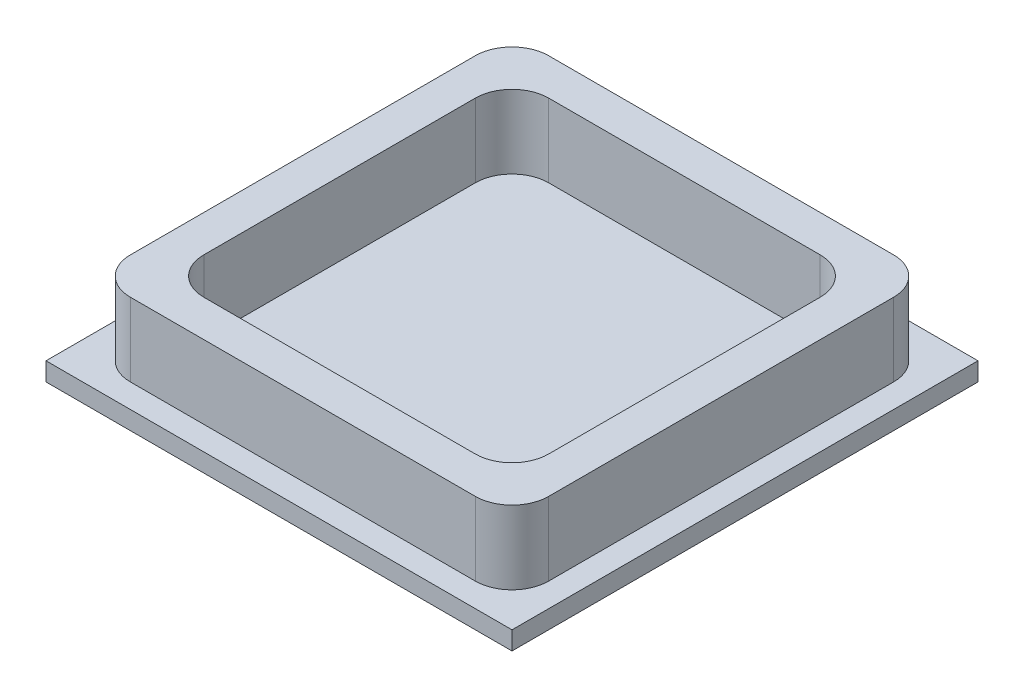
ISO-10303-21;
HEADER;
FILE_DESCRIPTION(('STEP AP214'),'2;1');
FILE_NAME('part.step','',(''),(''),'','','');
FILE_SCHEMA(('AUTOMOTIVE_DESIGN { 1 0 10303 214 1 1 1 1 }'));
ENDSEC;
DATA;
#1=APPLICATION_CONTEXT('core data for automotive mechanical design processes');
#2=APPLICATION_PROTOCOL_DEFINITION('international standard','automotive_design',2000,#1);
#3=PRODUCT_CONTEXT('',#1,'mechanical');
#4=PRODUCT('Part','Part','',(#3));
#5=PRODUCT_RELATED_PRODUCT_CATEGORY('part','',(#4));
#6=PRODUCT_DEFINITION_FORMATION('','',#4);
#7=PRODUCT_DEFINITION_CONTEXT('part definition',#1,'design');
#8=PRODUCT_DEFINITION('design','',#6,#7);
#9=PRODUCT_DEFINITION_SHAPE('','',#8);
#10=(LENGTH_UNIT() NAMED_UNIT(*) SI_UNIT(.MILLI.,.METRE.));
#11=(NAMED_UNIT(*) PLANE_ANGLE_UNIT() SI_UNIT($,.RADIAN.));
#12=(NAMED_UNIT(*) SI_UNIT($,.STERADIAN.) SOLID_ANGLE_UNIT());
#13=UNCERTAINTY_MEASURE_WITH_UNIT(LENGTH_MEASURE(1.E-05),#10,'distance_accuracy_value','');
#14=(GEOMETRIC_REPRESENTATION_CONTEXT(3) GLOBAL_UNCERTAINTY_ASSIGNED_CONTEXT((#13)) GLOBAL_UNIT_ASSIGNED_CONTEXT((#10,
#11,#12)) REPRESENTATION_CONTEXT('',''));
#15=CARTESIAN_POINT('',(0.,0.,0.));
#16=DIRECTION('',(0.,0.,1.));
#17=DIRECTION('',(1.,0.,0.));
#18=AXIS2_PLACEMENT_3D('',#15,#16,#17);
#19=CARTESIAN_POINT('',(0.,1.,0.));
#20=DIRECTION('',(0.,1.,0.));
#21=DIRECTION('',(0.,0.,1.));
#22=AXIS2_PLACEMENT_3D('',#19,#20,#21);
#23=PLANE('',#22);
#24=DIRECTION('',(0.,0.,1.));
#25=VECTOR('',#24,1.);
#26=CARTESIAN_POINT('',(-12.7,1.,12.7));
#27=LINE('',#26,#25);
#28=CARTESIAN_POINT('',(-12.7,1.,-12.7));
#29=VERTEX_POINT('',#28);
#30=CARTESIAN_POINT('',(-12.7,1.,12.7));
#31=VERTEX_POINT('',#30);
#32=EDGE_CURVE('E179',#29,#31,#27,.T.);
#33=ORIENTED_EDGE('',*,*,#32,.T.);
#34=DIRECTION('',(1.,0.,0.));
#35=VECTOR('',#34,1.);
#36=CARTESIAN_POINT('',(12.7,1.,12.7));
#37=LINE('',#36,#35);
#38=CARTESIAN_POINT('',(12.7,1.,12.7));
#39=VERTEX_POINT('',#38);
#40=EDGE_CURVE('E168',#31,#39,#37,.T.);
#41=ORIENTED_EDGE('',*,*,#40,.T.);
#42=DIRECTION('',(0.,0.,-1.));
#43=VECTOR('',#42,1.);
#44=CARTESIAN_POINT('',(12.7,1.,12.7));
#45=LINE('',#44,#43);
#46=CARTESIAN_POINT('',(12.7,1.,-12.7));
#47=VERTEX_POINT('',#46);
#48=EDGE_CURVE('E178',#39,#47,#45,.T.);
#49=ORIENTED_EDGE('',*,*,#48,.T.);
#50=DIRECTION('',(-1.,0.,0.));
#51=VECTOR('',#50,1.);
#52=CARTESIAN_POINT('',(12.7,1.,-12.7));
#53=LINE('',#52,#51);
#54=EDGE_CURVE('E183',#47,#29,#53,.T.);
#55=ORIENTED_EDGE('',*,*,#54,.T.);
#56=EDGE_LOOP('',(#33,#41,#49,#55));
#57=FACE_BOUND('',#56,.T.);
#58=DIRECTION('',(-1.,0.,0.));
#59=VECTOR('',#58,1.);
#60=CARTESIAN_POINT('',(-11.4,1.,-11.4));
#61=LINE('',#60,#59);
#62=CARTESIAN_POINT('',(9.40000000000001,1.,-11.4));
#63=VERTEX_POINT('',#62);
#64=CARTESIAN_POINT('',(-9.40000000000001,1.,-11.4));
#65=VERTEX_POINT('',#64);
#66=EDGE_CURVE('E266',#63,#65,#61,.T.);
#67=ORIENTED_EDGE('',*,*,#66,.F.);
#68=CARTESIAN_POINT('',(9.40000000000001,1.,-9.40000000000001));
#69=DIRECTION('',(0.,1.,0.));
#70=DIRECTION('',(0.,0.,1.));
#71=AXIS2_PLACEMENT_3D('',#68,#69,#70);
#72=CIRCLE('',#71,2.);
#73=CARTESIAN_POINT('',(11.4,1.,-9.40000000000001));
#74=VERTEX_POINT('',#73);
#75=EDGE_CURVE('E40',#63,#74,#72,.F.);
#76=ORIENTED_EDGE('',*,*,#75,.T.);
#77=DIRECTION('',(0.,0.,-1.));
#78=VECTOR('',#77,1.);
#79=CARTESIAN_POINT('',(11.4,1.,-11.4));
#80=LINE('',#79,#78);
#81=CARTESIAN_POINT('',(11.4,1.,9.40000000000001));
#82=VERTEX_POINT('',#81);
#83=EDGE_CURVE('E265',#82,#74,#80,.T.);
#84=ORIENTED_EDGE('',*,*,#83,.F.);
#85=CARTESIAN_POINT('',(9.40000000000001,1.,9.40000000000001));
#86=DIRECTION('',(0.,1.,0.));
#87=DIRECTION('',(0.,0.,1.));
#88=AXIS2_PLACEMENT_3D('',#85,#86,#87);
#89=CIRCLE('',#88,2.);
#90=CARTESIAN_POINT('',(9.40000000000001,1.,11.4));
#91=VERTEX_POINT('',#90);
#92=EDGE_CURVE('E262',#82,#91,#89,.F.);
#93=ORIENTED_EDGE('',*,*,#92,.T.);
#94=DIRECTION('',(1.,0.,0.));
#95=VECTOR('',#94,1.);
#96=CARTESIAN_POINT('',(-11.4,1.,11.4));
#97=LINE('',#96,#95);
#98=CARTESIAN_POINT('',(-9.40000000000001,1.,11.4));
#99=VERTEX_POINT('',#98);
#100=EDGE_CURVE('E292',#99,#91,#97,.T.);
#101=ORIENTED_EDGE('',*,*,#100,.F.);
#102=CARTESIAN_POINT('',(-9.40000000000001,1.,9.40000000000001));
#103=DIRECTION('',(0.,1.,0.));
#104=DIRECTION('',(0.,0.,1.));
#105=AXIS2_PLACEMENT_3D('',#102,#103,#104);
#106=CIRCLE('',#105,2.);
#107=CARTESIAN_POINT('',(-11.4,1.,9.40000000000001));
#108=VERTEX_POINT('',#107);
#109=EDGE_CURVE('E260',#99,#108,#106,.F.);
#110=ORIENTED_EDGE('',*,*,#109,.T.);
#111=DIRECTION('',(0.,0.,1.));
#112=VECTOR('',#111,1.);
#113=CARTESIAN_POINT('',(-11.4,1.,-11.4));
#114=LINE('',#113,#112);
#115=CARTESIAN_POINT('',(-11.4,1.,-9.40000000000001));
#116=VERTEX_POINT('',#115);
#117=EDGE_CURVE('E299',#116,#108,#114,.T.);
#118=ORIENTED_EDGE('',*,*,#117,.F.);
#119=CARTESIAN_POINT('',(-9.40000000000001,1.,-9.40000000000001));
#120=DIRECTION('',(0.,1.,0.));
#121=DIRECTION('',(0.,0.,1.));
#122=AXIS2_PLACEMENT_3D('',#119,#120,#121);
#123=CIRCLE('',#122,2.);
#124=EDGE_CURVE('E11',#116,#65,#123,.F.);
#125=ORIENTED_EDGE('',*,*,#124,.T.);
#126=EDGE_LOOP('',(#67,#76,#84,#93,#101,#110,#118,#125));
#127=FACE_BOUND('',#126,.T.);
#128=ADVANCED_FACE('F32',(#57,#127),#23,.T.);
#129=CARTESIAN_POINT('',(-12.7,1.,12.7));
#130=DIRECTION('',(1.,0.,0.));
#131=DIRECTION('',(0.,0.,-1.));
#132=AXIS2_PLACEMENT_3D('',#129,#130,#131);
#133=PLANE('',#132);
#134=DIRECTION('',(0.,0.,1.));
#135=VECTOR('',#134,1.);
#136=CARTESIAN_POINT('',(-12.7,0.,12.7));
#137=LINE('',#136,#135);
#138=CARTESIAN_POINT('',(-12.7,0.,-12.7));
#139=VERTEX_POINT('',#138);
#140=CARTESIAN_POINT('',(-12.7,0.,12.7));
#141=VERTEX_POINT('',#140);
#142=EDGE_CURVE('E191',#139,#141,#137,.T.);
#143=ORIENTED_EDGE('',*,*,#142,.T.);
#144=DIRECTION('',(0.,-1.,0.));
#145=VECTOR('',#144,1.);
#146=CARTESIAN_POINT('',(-12.7,1.,12.7));
#147=LINE('',#146,#145);
#148=EDGE_CURVE('E172',#31,#141,#147,.T.);
#149=ORIENTED_EDGE('',*,*,#148,.F.);
#150=ORIENTED_EDGE('',*,*,#32,.F.);
#151=DIRECTION('',(0.,-1.,0.));
#152=VECTOR('',#151,1.);
#153=CARTESIAN_POINT('',(-12.7,1.,-12.7));
#154=LINE('',#153,#152);
#155=EDGE_CURVE('E306',#29,#139,#154,.T.);
#156=ORIENTED_EDGE('',*,*,#155,.T.);
#157=EDGE_LOOP('',(#143,#149,#150,#156));
#158=FACE_BOUND('',#157,.T.);
#159=ADVANCED_FACE('F189',(#158),#133,.F.);
#160=CARTESIAN_POINT('',(12.7,1.,12.7));
#161=DIRECTION('',(0.,0.,-1.));
#162=DIRECTION('',(-1.,0.,0.));
#163=AXIS2_PLACEMENT_3D('',#160,#161,#162);
#164=PLANE('',#163);
#165=DIRECTION('',(1.,0.,0.));
#166=VECTOR('',#165,1.);
#167=CARTESIAN_POINT('',(12.7,0.,12.7));
#168=LINE('',#167,#166);
#169=CARTESIAN_POINT('',(12.7,0.,12.7));
#170=VERTEX_POINT('',#169);
#171=EDGE_CURVE('E308',#141,#170,#168,.T.);
#172=ORIENTED_EDGE('',*,*,#171,.T.);
#173=DIRECTION('',(0.,-1.,0.));
#174=VECTOR('',#173,1.);
#175=CARTESIAN_POINT('',(12.7,1.,12.7));
#176=LINE('',#175,#174);
#177=EDGE_CURVE('E175',#39,#170,#176,.T.);
#178=ORIENTED_EDGE('',*,*,#177,.F.);
#179=ORIENTED_EDGE('',*,*,#40,.F.);
#180=ORIENTED_EDGE('',*,*,#148,.T.);
#181=EDGE_LOOP('',(#172,#178,#179,#180));
#182=FACE_BOUND('',#181,.T.);
#183=ADVANCED_FACE('F170',(#182),#164,.F.);
#184=CARTESIAN_POINT('',(12.7,1.,12.7));
#185=DIRECTION('',(-1.,0.,0.));
#186=DIRECTION('',(0.,0.,1.));
#187=AXIS2_PLACEMENT_3D('',#184,#185,#186);
#188=PLANE('',#187);
#189=DIRECTION('',(0.,0.,-1.));
#190=VECTOR('',#189,1.);
#191=CARTESIAN_POINT('',(12.7,0.,12.7));
#192=LINE('',#191,#190);
#193=CARTESIAN_POINT('',(12.7,0.,-12.7));
#194=VERTEX_POINT('',#193);
#195=EDGE_CURVE('E310',#170,#194,#192,.T.);
#196=ORIENTED_EDGE('',*,*,#195,.T.);
#197=DIRECTION('',(0.,-1.,0.));
#198=VECTOR('',#197,1.);
#199=CARTESIAN_POINT('',(12.7,1.,-12.7));
#200=LINE('',#199,#198);
#201=EDGE_CURVE('E196',#47,#194,#200,.T.);
#202=ORIENTED_EDGE('',*,*,#201,.F.);
#203=ORIENTED_EDGE('',*,*,#48,.F.);
#204=ORIENTED_EDGE('',*,*,#177,.T.);
#205=EDGE_LOOP('',(#196,#202,#203,#204));
#206=FACE_BOUND('',#205,.T.);
#207=ADVANCED_FACE('F322',(#206),#188,.F.);
#208=CARTESIAN_POINT('',(12.7,1.,-12.7));
#209=DIRECTION('',(0.,0.,1.));
#210=DIRECTION('',(1.,0.,0.));
#211=AXIS2_PLACEMENT_3D('',#208,#209,#210);
#212=PLANE('',#211);
#213=DIRECTION('',(-1.,0.,0.));
#214=VECTOR('',#213,1.);
#215=CARTESIAN_POINT('',(12.7,0.,-12.7));
#216=LINE('',#215,#214);
#217=EDGE_CURVE('E187',#194,#139,#216,.T.);
#218=ORIENTED_EDGE('',*,*,#217,.T.);
#219=ORIENTED_EDGE('',*,*,#155,.F.);
#220=ORIENTED_EDGE('',*,*,#54,.F.);
#221=ORIENTED_EDGE('',*,*,#201,.T.);
#222=EDGE_LOOP('',(#218,#219,#220,#221));
#223=FACE_BOUND('',#222,.T.);
#224=ADVANCED_FACE('F317',(#223),#212,.F.);
#225=CARTESIAN_POINT('',(0.,0.,0.));
#226=DIRECTION('',(0.,1.,0.));
#227=DIRECTION('',(0.,0.,1.));
#228=AXIS2_PLACEMENT_3D('',#225,#226,#227);
#229=PLANE('',#228);
#230=ORIENTED_EDGE('',*,*,#142,.F.);
#231=ORIENTED_EDGE('',*,*,#217,.F.);
#232=ORIENTED_EDGE('',*,*,#195,.F.);
#233=ORIENTED_EDGE('',*,*,#171,.F.);
#234=EDGE_LOOP('',(#230,#231,#232,#233));
#235=FACE_BOUND('',#234,.T.);
#236=ADVANCED_FACE('F321',(#235),#229,.F.);
#237=CARTESIAN_POINT('',(0.,5.,0.));
#238=DIRECTION('',(0.,1.,0.));
#239=DIRECTION('',(0.,0.,1.));
#240=AXIS2_PLACEMENT_3D('',#237,#238,#239);
#241=PLANE('',#240);
#242=DIRECTION('',(0.,0.,1.));
#243=VECTOR('',#242,1.);
#244=CARTESIAN_POINT('',(-11.4,5.,-11.4));
#245=LINE('',#244,#243);
#246=CARTESIAN_POINT('',(-11.4,5.,-9.40000000000001));
#247=VERTEX_POINT('',#246);
#248=CARTESIAN_POINT('',(-11.4,5.,9.40000000000001));
#249=VERTEX_POINT('',#248);
#250=EDGE_CURVE('E288',#247,#249,#245,.T.);
#251=ORIENTED_EDGE('',*,*,#250,.T.);
#252=CARTESIAN_POINT('',(-9.40000000000001,5.,9.40000000000001));
#253=DIRECTION('',(0.,1.,0.));
#254=DIRECTION('',(0.,0.,1.));
#255=AXIS2_PLACEMENT_3D('',#252,#253,#254);
#256=CIRCLE('',#255,2.);
#257=CARTESIAN_POINT('',(-9.40000000000001,5.,11.4));
#258=VERTEX_POINT('',#257);
#259=EDGE_CURVE('E241',#249,#258,#256,.T.);
#260=ORIENTED_EDGE('',*,*,#259,.T.);
#261=DIRECTION('',(1.,0.,0.));
#262=VECTOR('',#261,1.);
#263=CARTESIAN_POINT('',(-11.4,5.,11.4));
#264=LINE('',#263,#262);
#265=CARTESIAN_POINT('',(9.40000000000001,5.,11.4));
#266=VERTEX_POINT('',#265);
#267=EDGE_CURVE('E290',#258,#266,#264,.T.);
#268=ORIENTED_EDGE('',*,*,#267,.T.);
#269=CARTESIAN_POINT('',(9.40000000000001,5.,9.40000000000001));
#270=DIRECTION('',(0.,1.,0.));
#271=DIRECTION('',(0.,0.,1.));
#272=AXIS2_PLACEMENT_3D('',#269,#270,#271);
#273=CIRCLE('',#272,2.);
#274=CARTESIAN_POINT('',(11.4,5.,9.40000000000001));
#275=VERTEX_POINT('',#274);
#276=EDGE_CURVE('E239',#266,#275,#273,.T.);
#277=ORIENTED_EDGE('',*,*,#276,.T.);
#278=DIRECTION('',(0.,0.,-1.));
#279=VECTOR('',#278,1.);
#280=CARTESIAN_POINT('',(11.4,5.,-11.4));
#281=LINE('',#280,#279);
#282=CARTESIAN_POINT('',(11.4,5.,-9.40000000000001));
#283=VERTEX_POINT('',#282);
#284=EDGE_CURVE('E284',#275,#283,#281,.T.);
#285=ORIENTED_EDGE('',*,*,#284,.T.);
#286=CARTESIAN_POINT('',(9.40000000000001,5.,-9.40000000000001));
#287=DIRECTION('',(0.,1.,0.));
#288=DIRECTION('',(0.,0.,1.));
#289=AXIS2_PLACEMENT_3D('',#286,#287,#288);
#290=CIRCLE('',#289,2.);
#291=CARTESIAN_POINT('',(9.40000000000001,5.,-11.4));
#292=VERTEX_POINT('',#291);
#293=EDGE_CURVE('E237',#283,#292,#290,.T.);
#294=ORIENTED_EDGE('',*,*,#293,.T.);
#295=DIRECTION('',(-1.,0.,0.));
#296=VECTOR('',#295,1.);
#297=CARTESIAN_POINT('',(-11.4,5.,-11.4));
#298=LINE('',#297,#296);
#299=CARTESIAN_POINT('',(-9.40000000000001,5.,-11.4));
#300=VERTEX_POINT('',#299);
#301=EDGE_CURVE('E282',#292,#300,#298,.T.);
#302=ORIENTED_EDGE('',*,*,#301,.T.);
#303=CARTESIAN_POINT('',(-9.40000000000001,5.,-9.40000000000001));
#304=DIRECTION('',(0.,1.,0.));
#305=DIRECTION('',(0.,0.,1.));
#306=AXIS2_PLACEMENT_3D('',#303,#304,#305);
#307=CIRCLE('',#306,2.);
#308=EDGE_CURVE('E235',#300,#247,#307,.T.);
#309=ORIENTED_EDGE('',*,*,#308,.T.);
#310=EDGE_LOOP('',(#251,#260,#268,#277,#285,#294,#302,#309));
#311=FACE_BOUND('',#310,.T.);
#312=DIRECTION('',(0.,0.,1.));
#313=VECTOR('',#312,1.);
#314=CARTESIAN_POINT('',(-9.40000000000001,5.,-9.40000000000001));
#315=LINE('',#314,#313);
#316=CARTESIAN_POINT('',(-9.40000000000001,5.,-7.40000000000001));
#317=VERTEX_POINT('',#316);
#318=CARTESIAN_POINT('',(-9.40000000000001,5.,7.40000000000001));
#319=VERTEX_POINT('',#318);
#320=EDGE_CURVE('E373',#317,#319,#315,.T.);
#321=ORIENTED_EDGE('',*,*,#320,.F.);
#322=CARTESIAN_POINT('',(-7.40000000000001,5.,-7.40000000000001));
#323=DIRECTION('',(0.,1.,0.));
#324=DIRECTION('',(0.,0.,1.));
#325=AXIS2_PLACEMENT_3D('',#322,#323,#324);
#326=CIRCLE('',#325,2.);
#327=CARTESIAN_POINT('',(-7.40000000000001,5.,-9.40000000000001));
#328=VERTEX_POINT('',#327);
#329=EDGE_CURVE('E258',#317,#328,#326,.F.);
#330=ORIENTED_EDGE('',*,*,#329,.T.);
#331=DIRECTION('',(-1.,0.,0.));
#332=VECTOR('',#331,1.);
#333=CARTESIAN_POINT('',(-9.40000000000001,5.,-9.40000000000001));
#334=LINE('',#333,#332);
#335=CARTESIAN_POINT('',(7.40000000000001,5.,-9.40000000000001));
#336=VERTEX_POINT('',#335);
#337=EDGE_CURVE('E370',#336,#328,#334,.T.);
#338=ORIENTED_EDGE('',*,*,#337,.F.);
#339=CARTESIAN_POINT('',(7.40000000000001,5.,-7.40000000000001));
#340=DIRECTION('',(0.,1.,0.));
#341=DIRECTION('',(0.,0.,1.));
#342=AXIS2_PLACEMENT_3D('',#339,#340,#341);
#343=CIRCLE('',#342,2.);
#344=CARTESIAN_POINT('',(9.40000000000001,5.,-7.40000000000001));
#345=VERTEX_POINT('',#344);
#346=EDGE_CURVE('E256',#336,#345,#343,.F.);
#347=ORIENTED_EDGE('',*,*,#346,.T.);
#348=DIRECTION('',(0.,0.,-1.));
#349=VECTOR('',#348,1.);
#350=CARTESIAN_POINT('',(9.40000000000001,5.,-9.40000000000001));
#351=LINE('',#350,#349);
#352=CARTESIAN_POINT('',(9.40000000000001,5.,7.40000000000001));
#353=VERTEX_POINT('',#352);
#354=EDGE_CURVE('E272',#353,#345,#351,.T.);
#355=ORIENTED_EDGE('',*,*,#354,.F.);
#356=CARTESIAN_POINT('',(7.40000000000001,5.,7.40000000000001));
#357=DIRECTION('',(0.,1.,0.));
#358=DIRECTION('',(0.,0.,1.));
#359=AXIS2_PLACEMENT_3D('',#356,#357,#358);
#360=CIRCLE('',#359,2.);
#361=CARTESIAN_POINT('',(7.40000000000001,5.,9.40000000000001));
#362=VERTEX_POINT('',#361);
#363=EDGE_CURVE('E254',#353,#362,#360,.F.);
#364=ORIENTED_EDGE('',*,*,#363,.T.);
#365=DIRECTION('',(1.,0.,0.));
#366=VECTOR('',#365,1.);
#367=CARTESIAN_POINT('',(-9.40000000000001,5.,9.40000000000001));
#368=LINE('',#367,#366);
#369=CARTESIAN_POINT('',(-7.40000000000001,5.,9.40000000000001));
#370=VERTEX_POINT('',#369);
#371=EDGE_CURVE('E379',#370,#362,#368,.T.);
#372=ORIENTED_EDGE('',*,*,#371,.F.);
#373=CARTESIAN_POINT('',(-7.40000000000001,5.,7.40000000000001));
#374=DIRECTION('',(0.,1.,0.));
#375=DIRECTION('',(0.,0.,1.));
#376=AXIS2_PLACEMENT_3D('',#373,#374,#375);
#377=CIRCLE('',#376,2.);
#378=EDGE_CURVE('E252',#370,#319,#377,.F.);
#379=ORIENTED_EDGE('',*,*,#378,.T.);
#380=EDGE_LOOP('',(#321,#330,#338,#347,#355,#364,#372,#379));
#381=FACE_BOUND('',#380,.T.);
#382=ADVANCED_FACE('F280',(#311,#381),#241,.T.);
#383=CARTESIAN_POINT('',(11.4,5.,-11.4));
#384=DIRECTION('',(-1.,0.,0.));
#385=DIRECTION('',(0.,0.,1.));
#386=AXIS2_PLACEMENT_3D('',#383,#384,#385);
#387=PLANE('',#386);
#388=ORIENTED_EDGE('',*,*,#284,.F.);
#389=DIRECTION('',(0.,-1.,0.));
#390=VECTOR('',#389,1.);
#391=CARTESIAN_POINT('',(11.4,5.,9.40000000000001));
#392=LINE('',#391,#390);
#393=EDGE_CURVE('E245',#275,#82,#392,.T.);
#394=ORIENTED_EDGE('',*,*,#393,.T.);
#395=ORIENTED_EDGE('',*,*,#83,.T.);
#396=DIRECTION('',(0.,-1.,0.));
#397=VECTOR('',#396,1.);
#398=CARTESIAN_POINT('',(11.4,5.,-9.40000000000001));
#399=LINE('',#398,#397);
#400=EDGE_CURVE('E243',#74,#283,#399,.F.);
#401=ORIENTED_EDGE('',*,*,#400,.T.);
#402=EDGE_LOOP('',(#388,#394,#395,#401));
#403=FACE_BOUND('',#402,.T.);
#404=ADVANCED_FACE('F269',(#403),#387,.F.);
#405=CARTESIAN_POINT('',(-11.4,5.,-11.4));
#406=DIRECTION('',(0.,0.,1.));
#407=DIRECTION('',(1.,0.,0.));
#408=AXIS2_PLACEMENT_3D('',#405,#406,#407);
#409=PLANE('',#408);
#410=ORIENTED_EDGE('',*,*,#301,.F.);
#411=DIRECTION('',(0.,-1.,0.));
#412=VECTOR('',#411,1.);
#413=CARTESIAN_POINT('',(9.40000000000001,5.,-11.4));
#414=LINE('',#413,#412);
#415=EDGE_CURVE('E250',#292,#63,#414,.T.);
#416=ORIENTED_EDGE('',*,*,#415,.T.);
#417=ORIENTED_EDGE('',*,*,#66,.T.);
#418=DIRECTION('',(0.,-1.,0.));
#419=VECTOR('',#418,1.);
#420=CARTESIAN_POINT('',(-9.40000000000001,5.,-11.4));
#421=LINE('',#420,#419);
#422=EDGE_CURVE('E248',#65,#300,#421,.F.);
#423=ORIENTED_EDGE('',*,*,#422,.T.);
#424=EDGE_LOOP('',(#410,#416,#417,#423));
#425=FACE_BOUND('',#424,.T.);
#426=ADVANCED_FACE('F286',(#425),#409,.F.);
#427=CARTESIAN_POINT('',(-11.4,5.,-11.4));
#428=DIRECTION('',(1.,0.,0.));
#429=DIRECTION('',(0.,0.,-1.));
#430=AXIS2_PLACEMENT_3D('',#427,#428,#429);
#431=PLANE('',#430);
#432=ORIENTED_EDGE('',*,*,#117,.T.);
#433=DIRECTION('',(0.,-1.,0.));
#434=VECTOR('',#433,1.);
#435=CARTESIAN_POINT('',(-11.4,5.,9.40000000000001));
#436=LINE('',#435,#434);
#437=EDGE_CURVE('E233',#108,#249,#436,.F.);
#438=ORIENTED_EDGE('',*,*,#437,.T.);
#439=ORIENTED_EDGE('',*,*,#250,.F.);
#440=DIRECTION('',(0.,-1.,0.));
#441=VECTOR('',#440,1.);
#442=CARTESIAN_POINT('',(-11.4,5.,-9.40000000000001));
#443=LINE('',#442,#441);
#444=EDGE_CURVE('E230',#247,#116,#443,.T.);
#445=ORIENTED_EDGE('',*,*,#444,.T.);
#446=EDGE_LOOP('',(#432,#438,#439,#445));
#447=FACE_BOUND('',#446,.T.);
#448=ADVANCED_FACE('F433',(#447),#431,.F.);
#449=CARTESIAN_POINT('',(-11.4,5.,11.4));
#450=DIRECTION('',(0.,0.,-1.));
#451=DIRECTION('',(-1.,0.,0.));
#452=AXIS2_PLACEMENT_3D('',#449,#450,#451);
#453=PLANE('',#452);
#454=ORIENTED_EDGE('',*,*,#267,.F.);
#455=DIRECTION('',(0.,-1.,0.));
#456=VECTOR('',#455,1.);
#457=CARTESIAN_POINT('',(-9.40000000000001,5.,11.4));
#458=LINE('',#457,#456);
#459=EDGE_CURVE('E227',#258,#99,#458,.T.);
#460=ORIENTED_EDGE('',*,*,#459,.T.);
#461=ORIENTED_EDGE('',*,*,#100,.T.);
#462=DIRECTION('',(0.,-1.,0.));
#463=VECTOR('',#462,1.);
#464=CARTESIAN_POINT('',(9.40000000000001,5.,11.4));
#465=LINE('',#464,#463);
#466=EDGE_CURVE('E225',#91,#266,#465,.F.);
#467=ORIENTED_EDGE('',*,*,#466,.T.);
#468=EDGE_LOOP('',(#454,#460,#461,#467));
#469=FACE_BOUND('',#468,.T.);
#470=ADVANCED_FACE('F439',(#469),#453,.F.);
#471=CARTESIAN_POINT('',(-9.40000000000001,5.,-9.40000000000001));
#472=DIRECTION('',(0.,0.,1.));
#473=DIRECTION('',(1.,0.,0.));
#474=AXIS2_PLACEMENT_3D('',#471,#472,#473);
#475=PLANE('',#474);
#476=DIRECTION('',(-1.,0.,0.));
#477=VECTOR('',#476,1.);
#478=CARTESIAN_POINT('',(-9.40000000000001,1.,-9.40000000000001));
#479=LINE('',#478,#477);
#480=CARTESIAN_POINT('',(7.40000000000001,1.,-9.40000000000001));
#481=VERTEX_POINT('',#480);
#482=CARTESIAN_POINT('',(-7.40000000000001,1.,-9.40000000000001));
#483=VERTEX_POINT('',#482);
#484=EDGE_CURVE('E363',#481,#483,#479,.T.);
#485=ORIENTED_EDGE('',*,*,#484,.F.);
#486=DIRECTION('',(0.,-1.,0.));
#487=VECTOR('',#486,1.);
#488=CARTESIAN_POINT('',(7.40000000000001,5.,-9.40000000000001));
#489=LINE('',#488,#487);
#490=EDGE_CURVE('E223',#481,#336,#489,.F.);
#491=ORIENTED_EDGE('',*,*,#490,.T.);
#492=ORIENTED_EDGE('',*,*,#337,.T.);
#493=DIRECTION('',(0.,-1.,0.));
#494=VECTOR('',#493,1.);
#495=CARTESIAN_POINT('',(-7.40000000000001,1.,-9.40000000000001));
#496=LINE('',#495,#494);
#497=EDGE_CURVE('E220',#328,#483,#496,.T.);
#498=ORIENTED_EDGE('',*,*,#497,.T.);
#499=EDGE_LOOP('',(#485,#491,#492,#498));
#500=FACE_BOUND('',#499,.T.);
#501=ADVANCED_FACE('F393',(#500),#475,.T.);
#502=CARTESIAN_POINT('',(-9.40000000000001,5.,-9.40000000000001));
#503=DIRECTION('',(1.,0.,0.));
#504=DIRECTION('',(0.,0.,-1.));
#505=AXIS2_PLACEMENT_3D('',#502,#503,#504);
#506=PLANE('',#505);
#507=ORIENTED_EDGE('',*,*,#320,.T.);
#508=DIRECTION('',(0.,-1.,0.));
#509=VECTOR('',#508,1.);
#510=CARTESIAN_POINT('',(-9.40000000000001,1.,7.40000000000001));
#511=LINE('',#510,#509);
#512=CARTESIAN_POINT('',(-9.40000000000001,1.,7.40000000000001));
#513=VERTEX_POINT('',#512);
#514=EDGE_CURVE('E194',#319,#513,#511,.T.);
#515=ORIENTED_EDGE('',*,*,#514,.T.);
#516=DIRECTION('',(0.,0.,1.));
#517=VECTOR('',#516,1.);
#518=CARTESIAN_POINT('',(-9.40000000000001,1.,-9.40000000000001));
#519=LINE('',#518,#517);
#520=CARTESIAN_POINT('',(-9.40000000000001,1.,-7.40000000000001));
#521=VERTEX_POINT('',#520);
#522=EDGE_CURVE('E356',#521,#513,#519,.T.);
#523=ORIENTED_EDGE('',*,*,#522,.F.);
#524=DIRECTION('',(0.,-1.,0.));
#525=VECTOR('',#524,1.);
#526=CARTESIAN_POINT('',(-9.40000000000001,5.,-7.40000000000001));
#527=LINE('',#526,#525);
#528=EDGE_CURVE('E192',#521,#317,#527,.F.);
#529=ORIENTED_EDGE('',*,*,#528,.T.);
#530=EDGE_LOOP('',(#507,#515,#523,#529));
#531=FACE_BOUND('',#530,.T.);
#532=ADVANCED_FACE('F398',(#531),#506,.T.);
#533=CARTESIAN_POINT('',(-9.40000000000001,5.,9.40000000000001));
#534=DIRECTION('',(0.,0.,-1.));
#535=DIRECTION('',(-1.,0.,0.));
#536=AXIS2_PLACEMENT_3D('',#533,#534,#535);
#537=PLANE('',#536);
#538=DIRECTION('',(1.,0.,0.));
#539=VECTOR('',#538,1.);
#540=CARTESIAN_POINT('',(-9.40000000000001,1.,9.40000000000001));
#541=LINE('',#540,#539);
#542=CARTESIAN_POINT('',(-7.40000000000001,1.,9.40000000000001));
#543=VERTEX_POINT('',#542);
#544=CARTESIAN_POINT('',(7.40000000000001,1.,9.40000000000001));
#545=VERTEX_POINT('',#544);
#546=EDGE_CURVE('E362',#543,#545,#541,.T.);
#547=ORIENTED_EDGE('',*,*,#546,.F.);
#548=DIRECTION('',(0.,-1.,0.));
#549=VECTOR('',#548,1.);
#550=CARTESIAN_POINT('',(-7.40000000000001,5.,9.40000000000001));
#551=LINE('',#550,#549);
#552=EDGE_CURVE('E213',#543,#370,#551,.F.);
#553=ORIENTED_EDGE('',*,*,#552,.T.);
#554=ORIENTED_EDGE('',*,*,#371,.T.);
#555=DIRECTION('',(0.,-1.,0.));
#556=VECTOR('',#555,1.);
#557=CARTESIAN_POINT('',(7.40000000000001,1.,9.40000000000001));
#558=LINE('',#557,#556);
#559=EDGE_CURVE('E210',#362,#545,#558,.T.);
#560=ORIENTED_EDGE('',*,*,#559,.T.);
#561=EDGE_LOOP('',(#547,#553,#554,#560));
#562=FACE_BOUND('',#561,.T.);
#563=ADVANCED_FACE('F351',(#562),#537,.T.);
#564=CARTESIAN_POINT('',(9.40000000000001,5.,-9.40000000000001));
#565=DIRECTION('',(-1.,0.,0.));
#566=DIRECTION('',(0.,0.,1.));
#567=AXIS2_PLACEMENT_3D('',#564,#565,#566);
#568=PLANE('',#567);
#569=DIRECTION('',(0.,0.,-1.));
#570=VECTOR('',#569,1.);
#571=CARTESIAN_POINT('',(9.40000000000001,1.,-9.40000000000001));
#572=LINE('',#571,#570);
#573=CARTESIAN_POINT('',(9.40000000000001,1.,7.40000000000001));
#574=VERTEX_POINT('',#573);
#575=CARTESIAN_POINT('',(9.40000000000001,1.,-7.40000000000001));
#576=VERTEX_POINT('',#575);
#577=EDGE_CURVE('E365',#574,#576,#572,.T.);
#578=ORIENTED_EDGE('',*,*,#577,.F.);
#579=DIRECTION('',(0.,-1.,0.));
#580=VECTOR('',#579,1.);
#581=CARTESIAN_POINT('',(9.40000000000001,5.,7.40000000000001));
#582=LINE('',#581,#580);
#583=EDGE_CURVE('E218',#574,#353,#582,.F.);
#584=ORIENTED_EDGE('',*,*,#583,.T.);
#585=ORIENTED_EDGE('',*,*,#354,.T.);
#586=DIRECTION('',(0.,-1.,0.));
#587=VECTOR('',#586,1.);
#588=CARTESIAN_POINT('',(9.40000000000001,1.,-7.40000000000001));
#589=LINE('',#588,#587);
#590=EDGE_CURVE('E215',#345,#576,#589,.T.);
#591=ORIENTED_EDGE('',*,*,#590,.T.);
#592=EDGE_LOOP('',(#578,#584,#585,#591));
#593=FACE_BOUND('',#592,.T.);
#594=ADVANCED_FACE('F342',(#593),#568,.T.);
#595=ORIENTED_EDGE('',*,*,#522,.T.);
#596=CARTESIAN_POINT('',(-7.40000000000001,1.,7.40000000000001));
#597=DIRECTION('',(0.,1.,0.));
#598=DIRECTION('',(0.,0.,1.));
#599=AXIS2_PLACEMENT_3D('',#596,#597,#598);
#600=CIRCLE('',#599,2.);
#601=EDGE_CURVE('E208',#513,#543,#600,.T.);
#602=ORIENTED_EDGE('',*,*,#601,.T.);
#603=ORIENTED_EDGE('',*,*,#546,.T.);
#604=CARTESIAN_POINT('',(7.40000000000001,1.,7.40000000000001));
#605=DIRECTION('',(0.,1.,0.));
#606=DIRECTION('',(0.,0.,1.));
#607=AXIS2_PLACEMENT_3D('',#604,#605,#606);
#608=CIRCLE('',#607,2.);
#609=EDGE_CURVE('E206',#545,#574,#608,.T.);
#610=ORIENTED_EDGE('',*,*,#609,.T.);
#611=ORIENTED_EDGE('',*,*,#577,.T.);
#612=CARTESIAN_POINT('',(7.40000000000001,1.,-7.40000000000001));
#613=DIRECTION('',(0.,1.,0.));
#614=DIRECTION('',(0.,0.,1.));
#615=AXIS2_PLACEMENT_3D('',#612,#613,#614);
#616=CIRCLE('',#615,2.);
#617=EDGE_CURVE('E204',#576,#481,#616,.T.);
#618=ORIENTED_EDGE('',*,*,#617,.T.);
#619=ORIENTED_EDGE('',*,*,#484,.T.);
#620=CARTESIAN_POINT('',(-7.40000000000001,1.,-7.40000000000001));
#621=DIRECTION('',(0.,1.,0.));
#622=DIRECTION('',(0.,0.,1.));
#623=AXIS2_PLACEMENT_3D('',#620,#621,#622);
#624=CIRCLE('',#623,2.);
#625=EDGE_CURVE('E202',#483,#521,#624,.T.);
#626=ORIENTED_EDGE('',*,*,#625,.T.);
#627=EDGE_LOOP('',(#595,#602,#603,#610,#611,#618,#619,#626));
#628=FACE_BOUND('',#627,.T.);
#629=ADVANCED_FACE('F333',(#628),#23,.T.);
#630=CARTESIAN_POINT('',(-7.40000000000001,5.,7.40000000000001));
#631=DIRECTION('',(0.,1.,0.));
#632=DIRECTION('',(0.,0.,1.));
#633=AXIS2_PLACEMENT_3D('',#630,#631,#632);
#634=CYLINDRICAL_SURFACE('',#633,2.);
#635=ORIENTED_EDGE('',*,*,#378,.F.);
#636=ORIENTED_EDGE('',*,*,#552,.F.);
#637=ORIENTED_EDGE('',*,*,#601,.F.);
#638=ORIENTED_EDGE('',*,*,#514,.F.);
#639=EDGE_LOOP('',(#635,#636,#637,#638));
#640=FACE_BOUND('',#639,.T.);
#641=ADVANCED_FACE('F341',(#640),#634,.F.);
#642=CARTESIAN_POINT('',(7.40000000000001,5.,7.40000000000001));
#643=DIRECTION('',(0.,1.,0.));
#644=DIRECTION('',(0.,0.,1.));
#645=AXIS2_PLACEMENT_3D('',#642,#643,#644);
#646=CYLINDRICAL_SURFACE('',#645,2.);
#647=ORIENTED_EDGE('',*,*,#363,.F.);
#648=ORIENTED_EDGE('',*,*,#583,.F.);
#649=ORIENTED_EDGE('',*,*,#609,.F.);
#650=ORIENTED_EDGE('',*,*,#559,.F.);
#651=EDGE_LOOP('',(#647,#648,#649,#650));
#652=FACE_BOUND('',#651,.T.);
#653=ADVANCED_FACE('F348',(#652),#646,.F.);
#654=CARTESIAN_POINT('',(7.40000000000001,5.,-7.40000000000001));
#655=DIRECTION('',(0.,1.,0.));
#656=DIRECTION('',(0.,0.,1.));
#657=AXIS2_PLACEMENT_3D('',#654,#655,#656);
#658=CYLINDRICAL_SURFACE('',#657,2.);
#659=ORIENTED_EDGE('',*,*,#346,.F.);
#660=ORIENTED_EDGE('',*,*,#490,.F.);
#661=ORIENTED_EDGE('',*,*,#617,.F.);
#662=ORIENTED_EDGE('',*,*,#590,.F.);
#663=EDGE_LOOP('',(#659,#660,#661,#662));
#664=FACE_BOUND('',#663,.T.);
#665=ADVANCED_FACE('F390',(#664),#658,.F.);
#666=CARTESIAN_POINT('',(-7.40000000000001,5.,-7.40000000000001));
#667=DIRECTION('',(0.,1.,0.));
#668=DIRECTION('',(0.,0.,1.));
#669=AXIS2_PLACEMENT_3D('',#666,#667,#668);
#670=CYLINDRICAL_SURFACE('',#669,2.);
#671=ORIENTED_EDGE('',*,*,#329,.F.);
#672=ORIENTED_EDGE('',*,*,#528,.F.);
#673=ORIENTED_EDGE('',*,*,#625,.F.);
#674=ORIENTED_EDGE('',*,*,#497,.F.);
#675=EDGE_LOOP('',(#671,#672,#673,#674));
#676=FACE_BOUND('',#675,.T.);
#677=ADVANCED_FACE('F396',(#676),#670,.F.);
#678=CARTESIAN_POINT('',(-9.40000000000001,5.,9.40000000000001));
#679=DIRECTION('',(0.,-1.,0.));
#680=DIRECTION('',(0.,0.,-1.));
#681=AXIS2_PLACEMENT_3D('',#678,#679,#680);
#682=CYLINDRICAL_SURFACE('',#681,2.);
#683=ORIENTED_EDGE('',*,*,#259,.F.);
#684=ORIENTED_EDGE('',*,*,#437,.F.);
#685=ORIENTED_EDGE('',*,*,#109,.F.);
#686=ORIENTED_EDGE('',*,*,#459,.F.);
#687=EDGE_LOOP('',(#683,#684,#685,#686));
#688=FACE_BOUND('',#687,.T.);
#689=ADVANCED_FACE('F415',(#688),#682,.T.);
#690=CARTESIAN_POINT('',(9.40000000000001,5.,9.40000000000001));
#691=DIRECTION('',(0.,-1.,0.));
#692=DIRECTION('',(0.,0.,-1.));
#693=AXIS2_PLACEMENT_3D('',#690,#691,#692);
#694=CYLINDRICAL_SURFACE('',#693,2.);
#695=ORIENTED_EDGE('',*,*,#276,.F.);
#696=ORIENTED_EDGE('',*,*,#466,.F.);
#697=ORIENTED_EDGE('',*,*,#92,.F.);
#698=ORIENTED_EDGE('',*,*,#393,.F.);
#699=EDGE_LOOP('',(#695,#696,#697,#698));
#700=FACE_BOUND('',#699,.T.);
#701=ADVANCED_FACE('F418',(#700),#694,.T.);
#702=CARTESIAN_POINT('',(9.40000000000001,5.,-9.40000000000001));
#703=DIRECTION('',(0.,-1.,0.));
#704=DIRECTION('',(0.,0.,-1.));
#705=AXIS2_PLACEMENT_3D('',#702,#703,#704);
#706=CYLINDRICAL_SURFACE('',#705,2.);
#707=ORIENTED_EDGE('',*,*,#293,.F.);
#708=ORIENTED_EDGE('',*,*,#400,.F.);
#709=ORIENTED_EDGE('',*,*,#75,.F.);
#710=ORIENTED_EDGE('',*,*,#415,.F.);
#711=EDGE_LOOP('',(#707,#708,#709,#710));
#712=FACE_BOUND('',#711,.T.);
#713=ADVANCED_FACE('F275',(#712),#706,.T.);
#714=CARTESIAN_POINT('',(-9.40000000000001,5.,-9.40000000000001));
#715=DIRECTION('',(0.,-1.,0.));
#716=DIRECTION('',(0.,0.,-1.));
#717=AXIS2_PLACEMENT_3D('',#714,#715,#716);
#718=CYLINDRICAL_SURFACE('',#717,2.);
#719=ORIENTED_EDGE('',*,*,#308,.F.);
#720=ORIENTED_EDGE('',*,*,#422,.F.);
#721=ORIENTED_EDGE('',*,*,#124,.F.);
#722=ORIENTED_EDGE('',*,*,#444,.F.);
#723=EDGE_LOOP('',(#719,#720,#721,#722));
#724=FACE_BOUND('',#723,.T.);
#725=ADVANCED_FACE('F34',(#724),#718,.T.);
#726=CLOSED_SHELL('',(#128,#159,#183,#207,#224,#236,#382,#404,#426,#448,#470,#501,#532,#563,
#594,#629,#641,#653,#665,#677,#689,#701,#713,#725));
#727=MANIFOLD_SOLID_BREP('B2',#726);
#728=ADVANCED_BREP_SHAPE_REPRESENTATION('',(#18,#727),#14);
#729=SHAPE_DEFINITION_REPRESENTATION(#9,#728);
ENDSEC;
END-ISO-10303-21;
